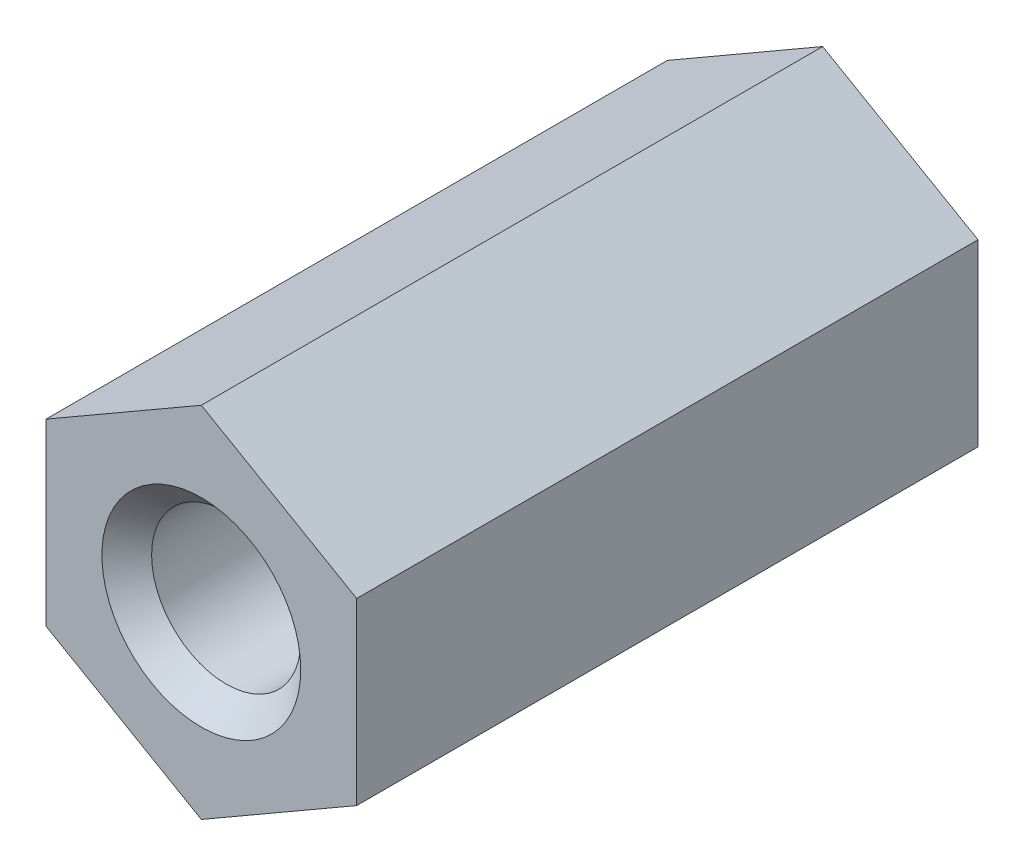
ISO-10303-21;
HEADER;
FILE_DESCRIPTION(('STEP AP214'),'2;1');
FILE_NAME('part.step','',(''),(''),'','','');
FILE_SCHEMA(('AUTOMOTIVE_DESIGN { 1 0 10303 214 1 1 1 1 }'));
ENDSEC;
DATA;
#1=APPLICATION_CONTEXT('core data for automotive mechanical design processes');
#2=APPLICATION_PROTOCOL_DEFINITION('international standard','automotive_design',2000,#1);
#3=PRODUCT_CONTEXT('',#1,'mechanical');
#4=PRODUCT('Part','Part','',(#3));
#5=PRODUCT_RELATED_PRODUCT_CATEGORY('part','',(#4));
#6=PRODUCT_DEFINITION_FORMATION('','',#4);
#7=PRODUCT_DEFINITION_CONTEXT('part definition',#1,'design');
#8=PRODUCT_DEFINITION('design','',#6,#7);
#9=PRODUCT_DEFINITION_SHAPE('','',#8);
#10=(LENGTH_UNIT() NAMED_UNIT(*) SI_UNIT(.MILLI.,.METRE.));
#11=(NAMED_UNIT(*) PLANE_ANGLE_UNIT() SI_UNIT($,.RADIAN.));
#12=(NAMED_UNIT(*) SI_UNIT($,.STERADIAN.) SOLID_ANGLE_UNIT());
#13=UNCERTAINTY_MEASURE_WITH_UNIT(LENGTH_MEASURE(1.E-05),#10,'distance_accuracy_value','');
#14=(GEOMETRIC_REPRESENTATION_CONTEXT(3) GLOBAL_UNCERTAINTY_ASSIGNED_CONTEXT((#13)) GLOBAL_UNIT_ASSIGNED_CONTEXT((#10,
#11,#12)) REPRESENTATION_CONTEXT('',''));
#15=CARTESIAN_POINT('',(0.,0.,0.));
#16=DIRECTION('',(0.,0.,1.));
#17=DIRECTION('',(1.,0.,0.));
#18=AXIS2_PLACEMENT_3D('',#15,#16,#17);
#19=CARTESIAN_POINT('',(0.,2.88675134594813,10.));
#20=DIRECTION('',(0.,0.,1.));
#21=DIRECTION('',(1.,0.,0.));
#22=AXIS2_PLACEMENT_3D('',#19,#20,#21);
#23=PLANE('',#22);
#24=CARTESIAN_POINT('',(0.,0.,10.));
#25=DIRECTION('',(0.,0.,1.));
#26=DIRECTION('',(1.,0.,0.));
#27=AXIS2_PLACEMENT_3D('',#24,#25,#26);
#28=CIRCLE('',#27,1.6);
#29=CARTESIAN_POINT('',(1.6,0.,10.));
#30=VERTEX_POINT('',#29);
#31=EDGE_CURVE('E43',#30,#30,#28,.F.);
#32=ORIENTED_EDGE('',*,*,#31,.T.);
#33=EDGE_LOOP('',(#32));
#34=FACE_BOUND('',#33,.T.);
#35=DIRECTION('',(-0.866025403784439,0.5,0.));
#36=VECTOR('',#35,1.);
#37=CARTESIAN_POINT('',(2.5,1.44337567297407,10.));
#38=LINE('',#37,#36);
#39=CARTESIAN_POINT('',(2.5,1.44337567297407,10.));
#40=VERTEX_POINT('',#39);
#41=CARTESIAN_POINT('',(0.,2.88675134594813,10.));
#42=VERTEX_POINT('',#41);
#43=EDGE_CURVE('E129',#40,#42,#38,.T.);
#44=ORIENTED_EDGE('',*,*,#43,.T.);
#45=DIRECTION('',(-0.866025403784439,-0.5,0.));
#46=VECTOR('',#45,1.);
#47=CARTESIAN_POINT('',(0.,2.88675134594813,10.));
#48=LINE('',#47,#46);
#49=CARTESIAN_POINT('',(-2.5,1.44337567297407,10.));
#50=VERTEX_POINT('',#49);
#51=EDGE_CURVE('E89',#42,#50,#48,.T.);
#52=ORIENTED_EDGE('',*,*,#51,.T.);
#53=DIRECTION('',(0.,-1.,0.));
#54=VECTOR('',#53,1.);
#55=CARTESIAN_POINT('',(-2.5,1.44337567297407,10.));
#56=LINE('',#55,#54);
#57=CARTESIAN_POINT('',(-2.5,-1.44337567297406,10.));
#58=VERTEX_POINT('',#57);
#59=EDGE_CURVE('E101',#50,#58,#56,.T.);
#60=ORIENTED_EDGE('',*,*,#59,.T.);
#61=DIRECTION('',(0.866025403784439,-0.5,0.));
#62=VECTOR('',#61,1.);
#63=CARTESIAN_POINT('',(-2.5,-1.44337567297406,10.));
#64=LINE('',#63,#62);
#65=CARTESIAN_POINT('',(0.,-2.88675134594813,10.));
#66=VERTEX_POINT('',#65);
#67=EDGE_CURVE('E96',#58,#66,#64,.T.);
#68=ORIENTED_EDGE('',*,*,#67,.T.);
#69=DIRECTION('',(0.866025403784439,0.5,0.));
#70=VECTOR('',#69,1.);
#71=CARTESIAN_POINT('',(0.,-2.88675134594813,10.));
#72=LINE('',#71,#70);
#73=CARTESIAN_POINT('',(2.5,-1.44337567297407,10.));
#74=VERTEX_POINT('',#73);
#75=EDGE_CURVE('E99',#66,#74,#72,.T.);
#76=ORIENTED_EDGE('',*,*,#75,.T.);
#77=DIRECTION('',(0.,1.,0.));
#78=VECTOR('',#77,1.);
#79=CARTESIAN_POINT('',(2.5,-1.44337567297407,10.));
#80=LINE('',#79,#78);
#81=EDGE_CURVE('E51',#74,#40,#80,.T.);
#82=ORIENTED_EDGE('',*,*,#81,.T.);
#83=EDGE_LOOP('',(#44,#52,#60,#68,#76,#82));
#84=FACE_BOUND('',#83,.T.);
#85=ADVANCED_FACE('F34',(#34,#84),#23,.T.);
#86=CARTESIAN_POINT('',(0.,2.88675134594813,0.));
#87=DIRECTION('',(0.,0.,1.));
#88=DIRECTION('',(1.,0.,0.));
#89=AXIS2_PLACEMENT_3D('',#86,#87,#88);
#90=PLANE('',#89);
#91=CARTESIAN_POINT('',(0.,0.,0.));
#92=DIRECTION('',(0.,0.,1.));
#93=DIRECTION('',(1.,0.,0.));
#94=AXIS2_PLACEMENT_3D('',#91,#92,#93);
#95=CIRCLE('',#94,1.6);
#96=CARTESIAN_POINT('',(-1.6,0.,0.));
#97=VERTEX_POINT('',#96);
#98=EDGE_CURVE('E11',#97,#97,#95,.T.);
#99=ORIENTED_EDGE('',*,*,#98,.T.);
#100=EDGE_LOOP('',(#99));
#101=FACE_BOUND('',#100,.T.);
#102=DIRECTION('',(-0.866025403784439,0.5,0.));
#103=VECTOR('',#102,1.);
#104=CARTESIAN_POINT('',(2.5,1.44337567297407,0.));
#105=LINE('',#104,#103);
#106=CARTESIAN_POINT('',(2.5,1.44337567297407,0.));
#107=VERTEX_POINT('',#106);
#108=CARTESIAN_POINT('',(0.,2.88675134594813,0.));
#109=VERTEX_POINT('',#108);
#110=EDGE_CURVE('E119',#107,#109,#105,.T.);
#111=ORIENTED_EDGE('',*,*,#110,.F.);
#112=DIRECTION('',(0.,1.,0.));
#113=VECTOR('',#112,1.);
#114=CARTESIAN_POINT('',(2.5,-1.44337567297407,0.));
#115=LINE('',#114,#113);
#116=CARTESIAN_POINT('',(2.5,-1.44337567297407,0.));
#117=VERTEX_POINT('',#116);
#118=EDGE_CURVE('E80',#117,#107,#115,.T.);
#119=ORIENTED_EDGE('',*,*,#118,.F.);
#120=DIRECTION('',(0.866025403784439,0.5,0.));
#121=VECTOR('',#120,1.);
#122=CARTESIAN_POINT('',(0.,-2.88675134594813,0.));
#123=LINE('',#122,#121);
#124=CARTESIAN_POINT('',(0.,-2.88675134594813,0.));
#125=VERTEX_POINT('',#124);
#126=EDGE_CURVE('E74',#125,#117,#123,.T.);
#127=ORIENTED_EDGE('',*,*,#126,.F.);
#128=DIRECTION('',(0.866025403784439,-0.5,0.));
#129=VECTOR('',#128,1.);
#130=CARTESIAN_POINT('',(-2.5,-1.44337567297406,0.));
#131=LINE('',#130,#129);
#132=CARTESIAN_POINT('',(-2.5,-1.44337567297406,0.));
#133=VERTEX_POINT('',#132);
#134=EDGE_CURVE('E109',#133,#125,#131,.T.);
#135=ORIENTED_EDGE('',*,*,#134,.F.);
#136=DIRECTION('',(0.,-1.,0.));
#137=VECTOR('',#136,1.);
#138=CARTESIAN_POINT('',(-2.5,1.44337567297407,0.));
#139=LINE('',#138,#137);
#140=CARTESIAN_POINT('',(-2.5,1.44337567297407,0.));
#141=VERTEX_POINT('',#140);
#142=EDGE_CURVE('E124',#141,#133,#139,.T.);
#143=ORIENTED_EDGE('',*,*,#142,.F.);
#144=DIRECTION('',(-0.866025403784439,-0.5,0.));
#145=VECTOR('',#144,1.);
#146=CARTESIAN_POINT('',(0.,2.88675134594813,0.));
#147=LINE('',#146,#145);
#148=EDGE_CURVE('E122',#109,#141,#147,.T.);
#149=ORIENTED_EDGE('',*,*,#148,.F.);
#150=EDGE_LOOP('',(#111,#119,#127,#135,#143,#149));
#151=FACE_BOUND('',#150,.T.);
#152=ADVANCED_FACE('F163',(#101,#151),#90,.F.);
#153=CARTESIAN_POINT('',(2.5,1.44337567297407,10.));
#154=DIRECTION('',(-0.5,-0.866025403784439,0.));
#155=DIRECTION('',(0.866025403784439,-0.5,0.));
#156=AXIS2_PLACEMENT_3D('',#153,#154,#155);
#157=PLANE('',#156);
#158=ORIENTED_EDGE('',*,*,#110,.T.);
#159=DIRECTION('',(0.,0.,-1.));
#160=VECTOR('',#159,1.);
#161=CARTESIAN_POINT('',(0.,2.88675134594813,10.));
#162=LINE('',#161,#160);
#163=EDGE_CURVE('E136',#42,#109,#162,.T.);
#164=ORIENTED_EDGE('',*,*,#163,.F.);
#165=ORIENTED_EDGE('',*,*,#43,.F.);
#166=DIRECTION('',(0.,0.,-1.));
#167=VECTOR('',#166,1.);
#168=CARTESIAN_POINT('',(2.5,1.44337567297407,10.));
#169=LINE('',#168,#167);
#170=EDGE_CURVE('E115',#40,#107,#169,.T.);
#171=ORIENTED_EDGE('',*,*,#170,.T.);
#172=EDGE_LOOP('',(#158,#164,#165,#171));
#173=FACE_BOUND('',#172,.T.);
#174=ADVANCED_FACE('F166',(#173),#157,.F.);
#175=CARTESIAN_POINT('',(0.,2.88675134594813,10.));
#176=DIRECTION('',(0.5,-0.866025403784439,0.));
#177=DIRECTION('',(0.866025403784439,0.5,0.));
#178=AXIS2_PLACEMENT_3D('',#175,#176,#177);
#179=PLANE('',#178);
#180=ORIENTED_EDGE('',*,*,#148,.T.);
#181=DIRECTION('',(0.,0.,-1.));
#182=VECTOR('',#181,1.);
#183=CARTESIAN_POINT('',(-2.5,1.44337567297407,10.));
#184=LINE('',#183,#182);
#185=EDGE_CURVE('E133',#50,#141,#184,.T.);
#186=ORIENTED_EDGE('',*,*,#185,.F.);
#187=ORIENTED_EDGE('',*,*,#51,.F.);
#188=ORIENTED_EDGE('',*,*,#163,.T.);
#189=EDGE_LOOP('',(#180,#186,#187,#188));
#190=FACE_BOUND('',#189,.T.);
#191=ADVANCED_FACE('F194',(#190),#179,.F.);
#192=CARTESIAN_POINT('',(-2.5,1.44337567297407,10.));
#193=DIRECTION('',(1.,0.,0.));
#194=DIRECTION('',(0.,0.,-1.));
#195=AXIS2_PLACEMENT_3D('',#192,#193,#194);
#196=PLANE('',#195);
#197=ORIENTED_EDGE('',*,*,#142,.T.);
#198=DIRECTION('',(0.,0.,-1.));
#199=VECTOR('',#198,1.);
#200=CARTESIAN_POINT('',(-2.5,-1.44337567297406,10.));
#201=LINE('',#200,#199);
#202=EDGE_CURVE('E110',#58,#133,#201,.T.);
#203=ORIENTED_EDGE('',*,*,#202,.F.);
#204=ORIENTED_EDGE('',*,*,#59,.F.);
#205=ORIENTED_EDGE('',*,*,#185,.T.);
#206=EDGE_LOOP('',(#197,#203,#204,#205));
#207=FACE_BOUND('',#206,.T.);
#208=ADVANCED_FACE('F201',(#207),#196,.F.);
#209=CARTESIAN_POINT('',(-2.5,-1.44337567297406,10.));
#210=DIRECTION('',(0.5,0.866025403784439,0.));
#211=DIRECTION('',(-0.866025403784439,0.5,0.));
#212=AXIS2_PLACEMENT_3D('',#209,#210,#211);
#213=PLANE('',#212);
#214=ORIENTED_EDGE('',*,*,#134,.T.);
#215=DIRECTION('',(0.,0.,-1.));
#216=VECTOR('',#215,1.);
#217=CARTESIAN_POINT('',(0.,-2.88675134594813,10.));
#218=LINE('',#217,#216);
#219=EDGE_CURVE('E106',#66,#125,#218,.T.);
#220=ORIENTED_EDGE('',*,*,#219,.F.);
#221=ORIENTED_EDGE('',*,*,#67,.F.);
#222=ORIENTED_EDGE('',*,*,#202,.T.);
#223=EDGE_LOOP('',(#214,#220,#221,#222));
#224=FACE_BOUND('',#223,.T.);
#225=ADVANCED_FACE('F107',(#224),#213,.F.);
#226=CARTESIAN_POINT('',(0.,-2.88675134594813,10.));
#227=DIRECTION('',(-0.5,0.866025403784439,0.));
#228=DIRECTION('',(-0.866025403784439,-0.5,0.));
#229=AXIS2_PLACEMENT_3D('',#226,#227,#228);
#230=PLANE('',#229);
#231=ORIENTED_EDGE('',*,*,#126,.T.);
#232=DIRECTION('',(0.,0.,-1.));
#233=VECTOR('',#232,1.);
#234=CARTESIAN_POINT('',(2.5,-1.44337567297407,10.));
#235=LINE('',#234,#233);
#236=EDGE_CURVE('E111',#74,#117,#235,.T.);
#237=ORIENTED_EDGE('',*,*,#236,.F.);
#238=ORIENTED_EDGE('',*,*,#75,.F.);
#239=ORIENTED_EDGE('',*,*,#219,.T.);
#240=EDGE_LOOP('',(#231,#237,#238,#239));
#241=FACE_BOUND('',#240,.T.);
#242=ADVANCED_FACE('F113',(#241),#230,.F.);
#243=CARTESIAN_POINT('',(2.5,-1.44337567297407,10.));
#244=DIRECTION('',(-1.,0.,0.));
#245=DIRECTION('',(0.,0.,1.));
#246=AXIS2_PLACEMENT_3D('',#243,#244,#245);
#247=PLANE('',#246);
#248=ORIENTED_EDGE('',*,*,#118,.T.);
#249=ORIENTED_EDGE('',*,*,#170,.F.);
#250=ORIENTED_EDGE('',*,*,#81,.F.);
#251=ORIENTED_EDGE('',*,*,#236,.T.);
#252=EDGE_LOOP('',(#248,#249,#250,#251));
#253=FACE_BOUND('',#252,.T.);
#254=ADVANCED_FACE('F155',(#253),#247,.F.);
#255=CARTESIAN_POINT('',(0.,0.,10.));
#256=DIRECTION('',(0.,0.,-1.));
#257=DIRECTION('',(-1.,0.,0.));
#258=AXIS2_PLACEMENT_3D('',#255,#256,#257);
#259=CYLINDRICAL_SURFACE('',#258,1.2);
#260=CARTESIAN_POINT('',(0.,0.,9.6));
#261=DIRECTION('',(0.,0.,1.));
#262=DIRECTION('',(1.,0.,0.));
#263=AXIS2_PLACEMENT_3D('',#260,#261,#262);
#264=CIRCLE('',#263,1.2);
#265=CARTESIAN_POINT('',(-1.2,0.,9.6));
#266=VERTEX_POINT('',#265);
#267=EDGE_CURVE('E141',#266,#266,#264,.T.);
#268=CARTESIAN_POINT('',(0.,0.,0.399999999999999));
#269=DIRECTION('',(0.,0.,1.));
#270=DIRECTION('',(1.,0.,0.));
#271=AXIS2_PLACEMENT_3D('',#268,#269,#270);
#272=CIRCLE('',#271,1.2);
#273=CARTESIAN_POINT('',(-1.2,0.,0.399999999999999));
#274=VERTEX_POINT('',#273);
#275=EDGE_CURVE('E138',#274,#274,#272,.F.);
#276=CARTESIAN_POINT('',(-1.2,0.,9.6));
#277=CARTESIAN_POINT('',(-1.2,0.,9.50416666666667));
#278=CARTESIAN_POINT('',(-1.2,0.,9.40833333333333));
#279=CARTESIAN_POINT('',(-1.2,0.,9.21666666666667));
#280=CARTESIAN_POINT('',(-1.2,0.,9.12083333333333));
#281=CARTESIAN_POINT('',(-1.2,0.,8.92916666666667));
#282=CARTESIAN_POINT('',(-1.2,0.,8.83333333333333));
#283=CARTESIAN_POINT('',(-1.2,0.,8.64166666666667));
#284=CARTESIAN_POINT('',(-1.2,0.,8.54583333333333));
#285=CARTESIAN_POINT('',(-1.2,0.,8.35416666666667));
#286=CARTESIAN_POINT('',(-1.2,0.,8.25833333333333));
#287=CARTESIAN_POINT('',(-1.2,0.,8.06666666666667));
#288=CARTESIAN_POINT('',(-1.2,0.,7.97083333333333));
#289=CARTESIAN_POINT('',(-1.2,0.,7.77916666666667));
#290=CARTESIAN_POINT('',(-1.2,0.,7.68333333333333));
#291=CARTESIAN_POINT('',(-1.2,0.,7.49166666666667));
#292=CARTESIAN_POINT('',(-1.2,0.,7.39583333333333));
#293=CARTESIAN_POINT('',(-1.2,0.,7.20416666666667));
#294=CARTESIAN_POINT('',(-1.2,0.,7.10833333333333));
#295=CARTESIAN_POINT('',(-1.2,0.,6.91666666666667));
#296=CARTESIAN_POINT('',(-1.2,0.,6.82083333333333));
#297=CARTESIAN_POINT('',(-1.2,0.,6.62916666666667));
#298=CARTESIAN_POINT('',(-1.2,0.,6.53333333333333));
#299=CARTESIAN_POINT('',(-1.2,0.,6.34166666666667));
#300=CARTESIAN_POINT('',(-1.2,0.,6.24583333333333));
#301=CARTESIAN_POINT('',(-1.2,0.,6.05416666666667));
#302=CARTESIAN_POINT('',(-1.2,0.,5.95833333333333));
#303=CARTESIAN_POINT('',(-1.2,0.,5.76666666666667));
#304=CARTESIAN_POINT('',(-1.2,0.,5.67083333333333));
#305=CARTESIAN_POINT('',(-1.2,0.,5.47916666666667));
#306=CARTESIAN_POINT('',(-1.2,0.,5.38333333333333));
#307=CARTESIAN_POINT('',(-1.2,0.,5.19166666666667));
#308=CARTESIAN_POINT('',(-1.2,0.,5.09583333333333));
#309=CARTESIAN_POINT('',(-1.2,0.,4.90416666666667));
#310=CARTESIAN_POINT('',(-1.2,0.,4.80833333333333));
#311=CARTESIAN_POINT('',(-1.2,0.,4.61666666666667));
#312=CARTESIAN_POINT('',(-1.2,0.,4.52083333333333));
#313=CARTESIAN_POINT('',(-1.2,0.,4.32916666666667));
#314=CARTESIAN_POINT('',(-1.2,0.,4.23333333333333));
#315=CARTESIAN_POINT('',(-1.2,0.,4.04166666666667));
#316=CARTESIAN_POINT('',(-1.2,0.,3.94583333333333));
#317=CARTESIAN_POINT('',(-1.2,0.,3.75416666666667));
#318=CARTESIAN_POINT('',(-1.2,0.,3.65833333333333));
#319=CARTESIAN_POINT('',(-1.2,0.,3.46666666666667));
#320=CARTESIAN_POINT('',(-1.2,0.,3.37083333333333));
#321=CARTESIAN_POINT('',(-1.2,0.,3.17916666666667));
#322=CARTESIAN_POINT('',(-1.2,0.,3.08333333333333));
#323=CARTESIAN_POINT('',(-1.2,0.,2.89166666666667));
#324=CARTESIAN_POINT('',(-1.2,0.,2.79583333333333));
#325=CARTESIAN_POINT('',(-1.2,0.,2.60416666666667));
#326=CARTESIAN_POINT('',(-1.2,0.,2.50833333333333));
#327=CARTESIAN_POINT('',(-1.2,0.,2.31666666666667));
#328=CARTESIAN_POINT('',(-1.2,0.,2.22083333333333));
#329=CARTESIAN_POINT('',(-1.2,0.,2.02916666666667));
#330=CARTESIAN_POINT('',(-1.2,0.,1.93333333333333));
#331=CARTESIAN_POINT('',(-1.2,0.,1.74166666666667));
#332=CARTESIAN_POINT('',(-1.2,0.,1.64583333333333));
#333=CARTESIAN_POINT('',(-1.2,0.,1.45416666666667));
#334=CARTESIAN_POINT('',(-1.2,0.,1.35833333333333));
#335=CARTESIAN_POINT('',(-1.2,0.,1.16666666666667));
#336=CARTESIAN_POINT('',(-1.2,0.,1.07083333333333));
#337=CARTESIAN_POINT('',(-1.2,0.,0.879166666666665));
#338=CARTESIAN_POINT('',(-1.2,0.,0.783333333333332));
#339=CARTESIAN_POINT('',(-1.2,0.,0.591666666666666));
#340=CARTESIAN_POINT('',(-1.2,0.,0.495833333333333));
#341=CARTESIAN_POINT('',(-1.2,0.,0.399999999999999));
#342=B_SPLINE_CURVE_WITH_KNOTS('',3,(#276,#277,#278,#279,#280,#281,#282,#283,#284,#285,#286,
#287,#288,#289,#290,#291,#292,#293,#294,#295,#296,#297,#298,#299,#300,#301,#302,#303,#304,#305,
#306,#307,#308,#309,#310,#311,#312,#313,#314,#315,#316,#317,#318,#319,#320,#321,#322,#323,#324,
#325,#326,#327,#328,#329,#330,#331,#332,#333,#334,#335,#336,#337,#338,#339,#340,#341),
.UNSPECIFIED.,.F.,.F.,(4,2,2,2,2,2,2,2,2,2,2,2,2,2,2,2,2,2,2,2,2,2,2,2,2,2,2,2,2,2,2,2,4),(0.,
0.287500000000001,0.575000000000001,0.8625,1.15,1.4375,1.725,2.0125,2.3,2.5875,2.875,3.1625,
3.45,3.7375,4.025,4.3125,4.6,4.8875,5.175,5.4625,5.75,6.0375,6.325,6.6125,6.9,7.1875,7.475,
7.7625,8.05,8.3375,8.625,8.9125,9.2),.UNSPECIFIED.);
#343=EDGE_CURVE('BSEAM150',#266,#274,#342,.T.);
#344=ORIENTED_EDGE('',*,*,#267,.T.);
#345=ORIENTED_EDGE('',*,*,#275,.T.);
#346=ORIENTED_EDGE('',*,*,#343,.T.);
#347=ORIENTED_EDGE('',*,*,#343,.F.);
#348=EDGE_LOOP('',(#344,#346,#345,#347));
#349=FACE_BOUND('',#348,.T.);
#350=ADVANCED_FACE('F150',(#349),#259,.F.);
#351=CARTESIAN_POINT('',(0.,0.,9.6));
#352=DIRECTION('',(0.,0.,1.));
#353=DIRECTION('',(1.,0.,0.));
#354=AXIS2_PLACEMENT_3D('',#351,#352,#353);
#355=CONICAL_SURFACE('',#354,1.2,0.785398163397453);
#356=ORIENTED_EDGE('',*,*,#31,.F.);
#357=EDGE_LOOP('',(#356));
#358=FACE_BOUND('',#357,.T.);
#359=ORIENTED_EDGE('',*,*,#267,.F.);
#360=EDGE_LOOP('',(#359));
#361=FACE_BOUND('',#360,.T.);
#362=ADVANCED_FACE('F147',(#358,#361),#355,.F.);
#363=CARTESIAN_POINT('',(0.,0.,0.));
#364=DIRECTION('',(0.,0.,-1.));
#365=DIRECTION('',(-1.,0.,0.));
#366=AXIS2_PLACEMENT_3D('',#363,#364,#365);
#367=CONICAL_SURFACE('',#366,1.6,0.785398163397448);
#368=CARTESIAN_POINT('',(-1.2,0.,0.399999999999999));
#369=CARTESIAN_POINT('',(-1.20416666666667,0.,0.395833333333333));
#370=CARTESIAN_POINT('',(-1.20833333333333,0.,0.391666666666666));
#371=CARTESIAN_POINT('',(-1.21666666666667,0.,0.383333333333333));
#372=CARTESIAN_POINT('',(-1.22083333333333,0.,0.379166666666666));
#373=CARTESIAN_POINT('',(-1.22916666666667,0.,0.370833333333333));
#374=CARTESIAN_POINT('',(-1.23333333333333,0.,0.366666666666666));
#375=CARTESIAN_POINT('',(-1.24166666666667,0.,0.358333333333333));
#376=CARTESIAN_POINT('',(-1.24583333333333,0.,0.354166666666666));
#377=CARTESIAN_POINT('',(-1.25416666666667,0.,0.345833333333333));
#378=CARTESIAN_POINT('',(-1.25833333333333,0.,0.341666666666666));
#379=CARTESIAN_POINT('',(-1.26666666666667,0.,0.333333333333333));
#380=CARTESIAN_POINT('',(-1.27083333333333,0.,0.329166666666666));
#381=CARTESIAN_POINT('',(-1.27916666666667,0.,0.320833333333333));
#382=CARTESIAN_POINT('',(-1.28333333333333,0.,0.316666666666666));
#383=CARTESIAN_POINT('',(-1.29166666666667,0.,0.308333333333333));
#384=CARTESIAN_POINT('',(-1.29583333333333,0.,0.304166666666666));
#385=CARTESIAN_POINT('',(-1.30416666666667,0.,0.295833333333333));
#386=CARTESIAN_POINT('',(-1.30833333333333,0.,0.291666666666666));
#387=CARTESIAN_POINT('',(-1.31666666666667,0.,0.283333333333333));
#388=CARTESIAN_POINT('',(-1.32083333333333,0.,0.279166666666666));
#389=CARTESIAN_POINT('',(-1.32916666666667,0.,0.270833333333333));
#390=CARTESIAN_POINT('',(-1.33333333333333,0.,0.266666666666666));
#391=CARTESIAN_POINT('',(-1.34166666666667,0.,0.258333333333333));
#392=CARTESIAN_POINT('',(-1.34583333333333,0.,0.254166666666666));
#393=CARTESIAN_POINT('',(-1.35416666666667,0.,0.245833333333333));
#394=CARTESIAN_POINT('',(-1.35833333333333,0.,0.241666666666666));
#395=CARTESIAN_POINT('',(-1.36666666666667,0.,0.233333333333333));
#396=CARTESIAN_POINT('',(-1.37083333333333,0.,0.229166666666666));
#397=CARTESIAN_POINT('',(-1.37916666666667,0.,0.220833333333333));
#398=CARTESIAN_POINT('',(-1.38333333333333,0.,0.216666666666666));
#399=CARTESIAN_POINT('',(-1.39166666666667,0.,0.208333333333333));
#400=CARTESIAN_POINT('',(-1.39583333333333,0.,0.204166666666666));
#401=CARTESIAN_POINT('',(-1.40416666666667,0.,0.195833333333333));
#402=CARTESIAN_POINT('',(-1.40833333333333,0.,0.191666666666666));
#403=CARTESIAN_POINT('',(-1.41666666666667,0.,0.183333333333333));
#404=CARTESIAN_POINT('',(-1.42083333333333,0.,0.179166666666666));
#405=CARTESIAN_POINT('',(-1.42916666666667,0.,0.170833333333333));
#406=CARTESIAN_POINT('',(-1.43333333333333,0.,0.166666666666666));
#407=CARTESIAN_POINT('',(-1.44166666666667,0.,0.158333333333333));
#408=CARTESIAN_POINT('',(-1.44583333333333,0.,0.154166666666666));
#409=CARTESIAN_POINT('',(-1.45416666666667,0.,0.145833333333333));
#410=CARTESIAN_POINT('',(-1.45833333333333,0.,0.141666666666666));
#411=CARTESIAN_POINT('',(-1.46666666666667,0.,0.133333333333333));
#412=CARTESIAN_POINT('',(-1.47083333333333,0.,0.129166666666666));
#413=CARTESIAN_POINT('',(-1.47916666666667,0.,0.120833333333333));
#414=CARTESIAN_POINT('',(-1.48333333333333,0.,0.116666666666666));
#415=CARTESIAN_POINT('',(-1.49166666666667,0.,0.108333333333333));
#416=CARTESIAN_POINT('',(-1.49583333333333,0.,0.104166666666666));
#417=CARTESIAN_POINT('',(-1.50416666666667,0.,0.0958333333333332));
#418=CARTESIAN_POINT('',(-1.50833333333333,0.,0.0916666666666665));
#419=CARTESIAN_POINT('',(-1.51666666666667,0.,0.0833333333333332));
#420=CARTESIAN_POINT('',(-1.52083333333333,0.,0.0791666666666665));
#421=CARTESIAN_POINT('',(-1.52916666666667,0.,0.0708333333333332));
#422=CARTESIAN_POINT('',(-1.53333333333333,0.,0.0666666666666666));
#423=CARTESIAN_POINT('',(-1.54166666666667,0.,0.0583333333333332));
#424=CARTESIAN_POINT('',(-1.54583333333333,0.,0.0541666666666666));
#425=CARTESIAN_POINT('',(-1.55416666666667,0.,0.0458333333333332));
#426=CARTESIAN_POINT('',(-1.55833333333333,0.,0.0416666666666666));
#427=CARTESIAN_POINT('',(-1.56666666666667,0.,0.0333333333333333));
#428=CARTESIAN_POINT('',(-1.57083333333333,0.,0.0291666666666666));
#429=CARTESIAN_POINT('',(-1.57916666666667,0.,0.0208333333333333));
#430=CARTESIAN_POINT('',(-1.58333333333333,0.,0.0166666666666666));
#431=CARTESIAN_POINT('',(-1.59166666666667,0.,0.00833333333333331));
#432=CARTESIAN_POINT('',(-1.59583333333333,0.,0.00416666666666664));
#433=CARTESIAN_POINT('',(-1.6,0.,0.));
#434=B_SPLINE_CURVE_WITH_KNOTS('',3,(#368,#369,#370,#371,#372,#373,#374,#375,#376,#377,#378,
#379,#380,#381,#382,#383,#384,#385,#386,#387,#388,#389,#390,#391,#392,#393,#394,#395,#396,#397,
#398,#399,#400,#401,#402,#403,#404,#405,#406,#407,#408,#409,#410,#411,#412,#413,#414,#415,#416,
#417,#418,#419,#420,#421,#422,#423,#424,#425,#426,#427,#428,#429,#430,#431,#432,#433),
.UNSPECIFIED.,.F.,.F.,(4,2,2,2,2,2,2,2,2,2,2,2,2,2,2,2,2,2,2,2,2,2,2,2,2,2,2,2,2,2,2,2,4),(0.,
0.0176776695296636,0.0353553390593272,0.053033008588991,0.0707106781186546,0.0883883476483183,
0.106066017177982,0.123743686707646,0.141421356237309,0.159099025766973,0.176776695296637,
0.1944543648263,0.212132034355964,0.229809703885628,0.247487373415291,0.265165042944955,
0.282842712474619,0.300520382004282,0.318198051533946,0.33587572106361,0.353553390593273,
0.371231060122937,0.3889087296526,0.406586399182264,0.424264068711928,0.441941738241591,
0.459619407771255,0.477297077300919,0.494974746830582,0.512652416360246,0.53033008588991,
0.548007755419573,0.565685424949237),.UNSPECIFIED.);
#435=EDGE_CURVE('BSEAM36',#274,#97,#434,.T.);
#436=ORIENTED_EDGE('',*,*,#275,.F.);
#437=ORIENTED_EDGE('',*,*,#98,.F.);
#438=ORIENTED_EDGE('',*,*,#435,.T.);
#439=ORIENTED_EDGE('',*,*,#435,.F.);
#440=EDGE_LOOP('',(#436,#438,#437,#439));
#441=FACE_BOUND('',#440,.T.);
#442=ADVANCED_FACE('F36',(#441),#367,.F.);
#443=CLOSED_SHELL('',(#85,#152,#174,#191,#208,#225,#242,#254,#350,#362,#442));
#444=MANIFOLD_SOLID_BREP('B2',#443);
#445=ADVANCED_BREP_SHAPE_REPRESENTATION('',(#18,#444),#14);
#446=SHAPE_DEFINITION_REPRESENTATION(#9,#445);
ENDSEC;
END-ISO-10303-21;
